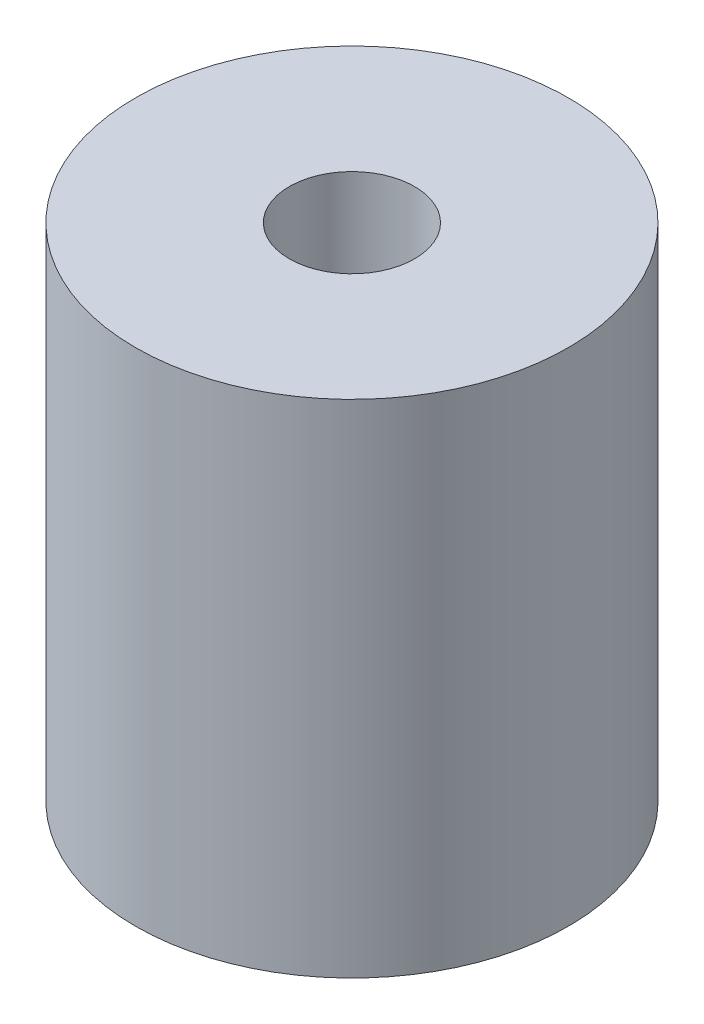
ISO-10303-21;
HEADER;
FILE_DESCRIPTION(('STEP AP214'),'2;1');
FILE_NAME('part.step','',(''),(''),'','','');
FILE_SCHEMA(('AUTOMOTIVE_DESIGN { 1 0 10303 214 1 1 1 1 }'));
ENDSEC;
DATA;
#1=APPLICATION_CONTEXT('core data for automotive mechanical design processes');
#2=APPLICATION_PROTOCOL_DEFINITION('international standard','automotive_design',2000,#1);
#3=PRODUCT_CONTEXT('',#1,'mechanical');
#4=PRODUCT('Part','Part','',(#3));
#5=PRODUCT_RELATED_PRODUCT_CATEGORY('part','',(#4));
#6=PRODUCT_DEFINITION_FORMATION('','',#4);
#7=PRODUCT_DEFINITION_CONTEXT('part definition',#1,'design');
#8=PRODUCT_DEFINITION('design','',#6,#7);
#9=PRODUCT_DEFINITION_SHAPE('','',#8);
#10=(LENGTH_UNIT() NAMED_UNIT(*) SI_UNIT(.MILLI.,.METRE.));
#11=(NAMED_UNIT(*) PLANE_ANGLE_UNIT() SI_UNIT($,.RADIAN.));
#12=(NAMED_UNIT(*) SI_UNIT($,.STERADIAN.) SOLID_ANGLE_UNIT());
#13=UNCERTAINTY_MEASURE_WITH_UNIT(LENGTH_MEASURE(1.E-05),#10,'distance_accuracy_value','');
#14=(GEOMETRIC_REPRESENTATION_CONTEXT(3) GLOBAL_UNCERTAINTY_ASSIGNED_CONTEXT((#13)) GLOBAL_UNIT_ASSIGNED_CONTEXT((#10,
#11,#12)) REPRESENTATION_CONTEXT('',''));
#15=CARTESIAN_POINT('',(0.,0.,0.));
#16=DIRECTION('',(0.,0.,1.));
#17=DIRECTION('',(1.,0.,0.));
#18=AXIS2_PLACEMENT_3D('',#15,#16,#17);
#19=CARTESIAN_POINT('',(0.,11.,0.));
#20=DIRECTION('',(0.,-1.,0.));
#21=DIRECTION('',(0.,0.,-1.));
#22=AXIS2_PLACEMENT_3D('',#19,#20,#21);
#23=CYLINDRICAL_SURFACE('',#22,9.5);
#24=CARTESIAN_POINT('',(0.,11.,0.));
#25=DIRECTION('',(0.,1.,0.));
#26=DIRECTION('',(0.,0.,1.));
#27=AXIS2_PLACEMENT_3D('',#24,#25,#26);
#28=CIRCLE('',#27,9.5);
#29=CARTESIAN_POINT('',(0.,11.,9.5));
#30=VERTEX_POINT('',#29);
#31=EDGE_CURVE('E40',#30,#30,#28,.T.);
#32=ORIENTED_EDGE('',*,*,#31,.F.);
#33=EDGE_LOOP('',(#32));
#34=FACE_BOUND('',#33,.T.);
#35=CARTESIAN_POINT('',(0.,-11.,0.));
#36=DIRECTION('',(0.,1.,0.));
#37=DIRECTION('',(0.,0.,1.));
#38=AXIS2_PLACEMENT_3D('',#35,#36,#37);
#39=CIRCLE('',#38,9.5);
#40=CARTESIAN_POINT('',(0.,-11.,9.5));
#41=VERTEX_POINT('',#40);
#42=EDGE_CURVE('E46',#41,#41,#39,.T.);
#43=ORIENTED_EDGE('',*,*,#42,.T.);
#44=EDGE_LOOP('',(#43));
#45=FACE_BOUND('',#44,.T.);
#46=ADVANCED_FACE('F33',(#34,#45),#23,.T.);
#47=CARTESIAN_POINT('',(0.,11.,0.));
#48=DIRECTION('',(0.,-1.,0.));
#49=DIRECTION('',(0.,0.,-1.));
#50=AXIS2_PLACEMENT_3D('',#47,#48,#49);
#51=CYLINDRICAL_SURFACE('',#50,2.75);
#52=CARTESIAN_POINT('',(0.,11.,0.));
#53=DIRECTION('',(0.,1.,0.));
#54=DIRECTION('',(0.,0.,1.));
#55=AXIS2_PLACEMENT_3D('',#52,#53,#54);
#56=CIRCLE('',#55,2.75);
#57=CARTESIAN_POINT('',(0.,11.,2.75));
#58=VERTEX_POINT('',#57);
#59=EDGE_CURVE('E10',#58,#58,#56,.T.);
#60=ORIENTED_EDGE('',*,*,#59,.T.);
#61=EDGE_LOOP('',(#60));
#62=FACE_BOUND('',#61,.T.);
#63=CARTESIAN_POINT('',(0.,-11.,0.));
#64=DIRECTION('',(0.,1.,0.));
#65=DIRECTION('',(0.,0.,1.));
#66=AXIS2_PLACEMENT_3D('',#63,#64,#65);
#67=CIRCLE('',#66,2.75);
#68=CARTESIAN_POINT('',(0.,-11.,2.75));
#69=VERTEX_POINT('',#68);
#70=EDGE_CURVE('E36',#69,#69,#67,.T.);
#71=ORIENTED_EDGE('',*,*,#70,.F.);
#72=EDGE_LOOP('',(#71));
#73=FACE_BOUND('',#72,.T.);
#74=ADVANCED_FACE('F55',(#62,#73),#51,.F.);
#75=CARTESIAN_POINT('',(0.,11.,0.));
#76=DIRECTION('',(0.,1.,0.));
#77=DIRECTION('',(0.,0.,1.));
#78=AXIS2_PLACEMENT_3D('',#75,#76,#77);
#79=PLANE('',#78);
#80=ORIENTED_EDGE('',*,*,#31,.T.);
#81=EDGE_LOOP('',(#80));
#82=FACE_BOUND('',#81,.T.);
#83=ORIENTED_EDGE('',*,*,#59,.F.);
#84=EDGE_LOOP('',(#83));
#85=FACE_BOUND('',#84,.T.);
#86=ADVANCED_FACE('F57',(#82,#85),#79,.T.);
#87=CARTESIAN_POINT('',(0.,-11.,0.));
#88=DIRECTION('',(0.,1.,0.));
#89=DIRECTION('',(0.,0.,1.));
#90=AXIS2_PLACEMENT_3D('',#87,#88,#89);
#91=PLANE('',#90);
#92=ORIENTED_EDGE('',*,*,#42,.F.);
#93=EDGE_LOOP('',(#92));
#94=FACE_BOUND('',#93,.T.);
#95=ORIENTED_EDGE('',*,*,#70,.T.);
#96=EDGE_LOOP('',(#95));
#97=FACE_BOUND('',#96,.T.);
#98=ADVANCED_FACE('F53',(#94,#97),#91,.F.);
#99=CLOSED_SHELL('',(#46,#74,#86,#98));
#100=MANIFOLD_SOLID_BREP('B2',#99);
#101=ADVANCED_BREP_SHAPE_REPRESENTATION('',(#18,#100),#14);
#102=SHAPE_DEFINITION_REPRESENTATION(#9,#101);
ENDSEC;
END-ISO-10303-21;
